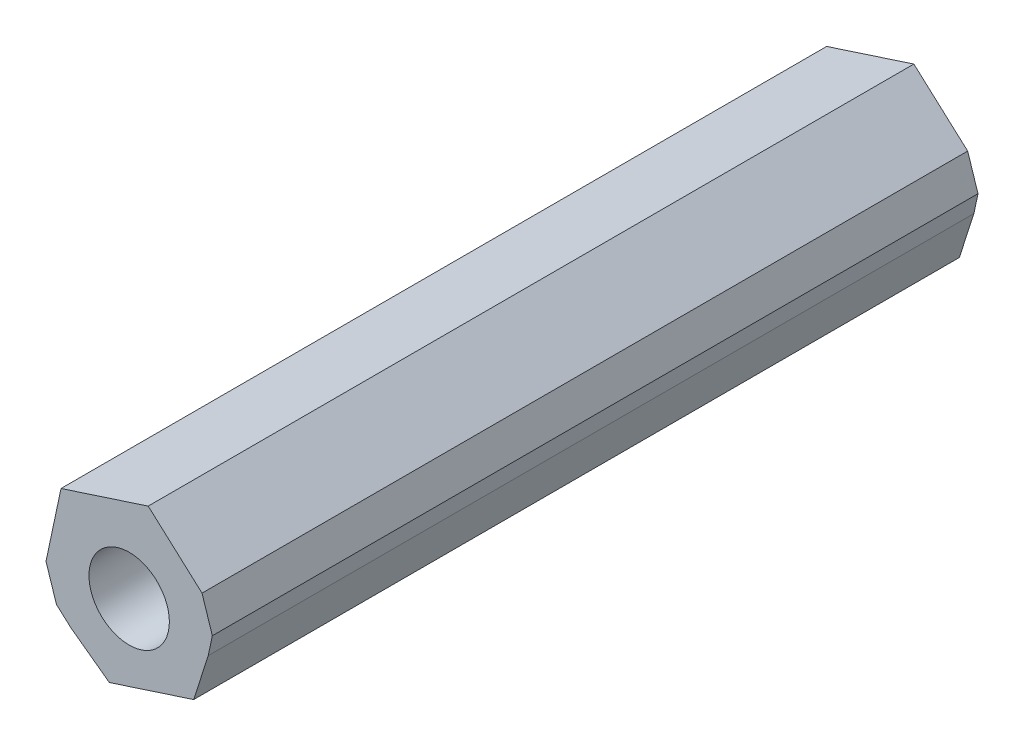
ISO-10303-21;
HEADER;
FILE_DESCRIPTION(('STEP AP214'),'2;1');
FILE_NAME('part.step','',(''),(''),'','','');
FILE_SCHEMA(('AUTOMOTIVE_DESIGN { 1 0 10303 214 1 1 1 1 }'));
ENDSEC;
DATA;
#1=APPLICATION_CONTEXT('core data for automotive mechanical design processes');
#2=APPLICATION_PROTOCOL_DEFINITION('international standard','automotive_design',2000,#1);
#3=PRODUCT_CONTEXT('',#1,'mechanical');
#4=PRODUCT('Part','Part','',(#3));
#5=PRODUCT_RELATED_PRODUCT_CATEGORY('part','',(#4));
#6=PRODUCT_DEFINITION_FORMATION('','',#4);
#7=PRODUCT_DEFINITION_CONTEXT('part definition',#1,'design');
#8=PRODUCT_DEFINITION('design','',#6,#7);
#9=PRODUCT_DEFINITION_SHAPE('','',#8);
#10=(LENGTH_UNIT() NAMED_UNIT(*) SI_UNIT(.MILLI.,.METRE.));
#11=(NAMED_UNIT(*) PLANE_ANGLE_UNIT() SI_UNIT($,.RADIAN.));
#12=(NAMED_UNIT(*) SI_UNIT($,.STERADIAN.) SOLID_ANGLE_UNIT());
#13=UNCERTAINTY_MEASURE_WITH_UNIT(LENGTH_MEASURE(1.E-05),#10,'distance_accuracy_value','');
#14=(GEOMETRIC_REPRESENTATION_CONTEXT(3) GLOBAL_UNCERTAINTY_ASSIGNED_CONTEXT((#13)) GLOBAL_UNIT_ASSIGNED_CONTEXT((#10,
#11,#12)) REPRESENTATION_CONTEXT('',''));
#15=CARTESIAN_POINT('',(0.,0.,0.));
#16=DIRECTION('',(0.,0.,1.));
#17=DIRECTION('',(1.,0.,0.));
#18=AXIS2_PLACEMENT_3D('',#15,#16,#17);
#19=CARTESIAN_POINT('',(0.,0.,23.8));
#20=DIRECTION('',(0.,0.,-1.));
#21=DIRECTION('',(-1.,0.,0.));
#22=AXIS2_PLACEMENT_3D('',#19,#20,#21);
#23=PLANE('',#22);
#24=DIRECTION('',(0.806848201508778,-0.590758816880502,0.));
#25=VECTOR('',#24,1.);
#26=CARTESIAN_POINT('',(-1.81056442175329,-1.6910093841118,23.8));
#27=LINE('',#26,#25);
#28=CARTESIAN_POINT('',(-1.81056442175329,-1.6910093841118,23.8));
#29=VERTEX_POINT('',#28);
#30=CARTESIAN_POINT('',(-0.615744095653542,-2.5658339681061,23.8));
#31=VERTEX_POINT('',#30);
#32=EDGE_CURVE('E182',#29,#31,#27,.T.);
#33=ORIENTED_EDGE('',*,*,#32,.T.);
#34=DIRECTION('',(0.951061509544699,0.309001626310541,0.));
#35=VECTOR('',#34,1.);
#36=CARTESIAN_POINT('',(-0.615744095653542,-2.5658339681061,23.8));
#37=LINE('',#36,#35);
#38=CARTESIAN_POINT('',(2.00625141405096,-1.71394282484504,23.8));
#39=VERTEX_POINT('',#38);
#40=EDGE_CURVE('E106',#31,#39,#37,.T.);
#41=ORIENTED_EDGE('',*,*,#40,.T.);
#42=DIRECTION('',(0.305545359113446,0.952177522064155,0.));
#43=VECTOR('',#42,1.);
#44=CARTESIAN_POINT('',(2.45871794360576,-0.303911724459414,23.8));
#45=LINE('',#44,#43);
#46=CARTESIAN_POINT('',(2.45871794360576,-0.303911724459414,23.8));
#47=VERTEX_POINT('',#46);
#48=EDGE_CURVE('E211',#39,#47,#45,.T.);
#49=ORIENTED_EDGE('',*,*,#48,.T.);
#50=DIRECTION('',(0.20792749657669,0.978144240982561,0.));
#51=VECTOR('',#50,1.);
#52=CARTESIAN_POINT('',(2.5859251555958,0.294503607173342,23.8));
#53=LINE('',#52,#51);
#54=CARTESIAN_POINT('',(2.5859251555958,0.294503607173342,23.8));
#55=VERTEX_POINT('',#54);
#56=EDGE_CURVE('E231',#47,#55,#53,.T.);
#57=ORIENTED_EDGE('',*,*,#56,.T.);
#58=DIRECTION('',(-0.309001626310541,0.951061509544699,0.));
#59=VECTOR('',#58,1.);
#60=CARTESIAN_POINT('',(2.26520369496625,1.28163704116757,23.8));
#61=LINE('',#60,#59);
#62=CARTESIAN_POINT('',(2.26520369496625,1.28163704116757,23.8));
#63=VERTEX_POINT('',#62);
#64=EDGE_CURVE('E227',#55,#63,#61,.T.);
#65=ORIENTED_EDGE('',*,*,#64,.T.);
#66=DIRECTION('',(-0.743134012967995,0.669142614672002,0.));
#67=VECTOR('',#66,1.);
#68=CARTESIAN_POINT('',(0.592593365243585,2.78771108680034,23.8));
#69=LINE('',#68,#67);
#70=CARTESIAN_POINT('',(0.592593365243585,2.78771108680034,23.8));
#71=VERTEX_POINT('',#70);
#72=EDGE_CURVE('E230',#63,#71,#69,.T.);
#73=ORIENTED_EDGE('',*,*,#72,.T.);
#74=DIRECTION('',(-0.951061509544693,-0.309001626310557,0.));
#75=VECTOR('',#74,1.);
#76=CARTESIAN_POINT('',(0.592593365243585,2.78771108680034,23.8));
#77=LINE('',#76,#75);
#78=CARTESIAN_POINT('',(-2.11793193695881,1.90705645181525,23.8));
#79=VERTEX_POINT('',#78);
#80=EDGE_CURVE('E131',#71,#79,#77,.T.);
#81=ORIENTED_EDGE('',*,*,#80,.T.);
#82=DIRECTION('',(-0.20792749657669,-0.978144240982561,0.));
#83=VECTOR('',#82,1.);
#84=CARTESIAN_POINT('',(-2.11793193695881,1.90705645181525,23.8));
#85=LINE('',#84,#83);
#86=CARTESIAN_POINT('',(-2.58462162290409,-0.288371455262786,23.8));
#87=VERTEX_POINT('',#86);
#88=EDGE_CURVE('E125',#79,#87,#85,.T.);
#89=ORIENTED_EDGE('',*,*,#88,.T.);
#90=DIRECTION('',(0.309001626310541,-0.951061509544699,0.));
#91=VECTOR('',#90,1.);
#92=CARTESIAN_POINT('',(-2.58462162290409,-0.288371455262786,23.8));
#93=LINE('',#92,#91);
#94=CARTESIAN_POINT('',(-2.26054486197784,-1.28583200954843,23.8));
#95=VERTEX_POINT('',#94);
#96=EDGE_CURVE('E129',#87,#95,#93,.T.);
#97=ORIENTED_EDGE('',*,*,#96,.T.);
#98=DIRECTION('',(0.743134012967984,-0.669142614672015,0.));
#99=VECTOR('',#98,1.);
#100=CARTESIAN_POINT('',(-2.26054486197784,-1.28583200954843,23.8));
#101=LINE('',#100,#99);
#102=EDGE_CURVE('E57',#95,#29,#101,.T.);
#103=ORIENTED_EDGE('',*,*,#102,.T.);
#104=EDGE_LOOP('',(#33,#41,#49,#57,#65,#73,#81,#89,#97,#103));
#105=FACE_BOUND('',#104,.T.);
#106=CARTESIAN_POINT('',(0.,0.,23.8));
#107=DIRECTION('',(0.,0.,1.));
#108=DIRECTION('',(1.,0.,0.));
#109=AXIS2_PLACEMENT_3D('',#106,#107,#108);
#110=CIRCLE('',#109,1.25);
#111=CARTESIAN_POINT('',(1.25,0.,23.8));
#112=VERTEX_POINT('',#111);
#113=EDGE_CURVE('E158',#112,#112,#110,.T.);
#114=ORIENTED_EDGE('',*,*,#113,.F.);
#115=EDGE_LOOP('',(#114));
#116=FACE_BOUND('',#115,.T.);
#117=ADVANCED_FACE('F39',(#105,#116),#23,.F.);
#118=CARTESIAN_POINT('',(0.,0.,0.));
#119=DIRECTION('',(0.,0.,-1.));
#120=DIRECTION('',(-1.,0.,0.));
#121=AXIS2_PLACEMENT_3D('',#118,#119,#120);
#122=PLANE('',#121);
#123=DIRECTION('',(0.806848201508778,-0.590758816880502,0.));
#124=VECTOR('',#123,1.);
#125=CARTESIAN_POINT('',(-1.81056442175329,-1.6910093841118,0.));
#126=LINE('',#125,#124);
#127=CARTESIAN_POINT('',(-1.81056442175329,-1.6910093841118,0.));
#128=VERTEX_POINT('',#127);
#129=CARTESIAN_POINT('',(-0.615744095653542,-2.5658339681061,0.));
#130=VERTEX_POINT('',#129);
#131=EDGE_CURVE('E153',#128,#130,#126,.T.);
#132=ORIENTED_EDGE('',*,*,#131,.F.);
#133=DIRECTION('',(0.743134012967984,-0.669142614672015,0.));
#134=VECTOR('',#133,1.);
#135=CARTESIAN_POINT('',(-2.26054486197784,-1.28583200954843,0.));
#136=LINE('',#135,#134);
#137=CARTESIAN_POINT('',(-2.26054486197784,-1.28583200954843,0.));
#138=VERTEX_POINT('',#137);
#139=EDGE_CURVE('E98',#138,#128,#136,.T.);
#140=ORIENTED_EDGE('',*,*,#139,.F.);
#141=DIRECTION('',(0.309001626310541,-0.951061509544699,0.));
#142=VECTOR('',#141,1.);
#143=CARTESIAN_POINT('',(-2.58462162290409,-0.288371455262786,0.));
#144=LINE('',#143,#142);
#145=CARTESIAN_POINT('',(-2.58462162290409,-0.288371455262786,0.));
#146=VERTEX_POINT('',#145);
#147=EDGE_CURVE('E92',#146,#138,#144,.T.);
#148=ORIENTED_EDGE('',*,*,#147,.F.);
#149=DIRECTION('',(-0.20792749657669,-0.978144240982561,0.));
#150=VECTOR('',#149,1.);
#151=CARTESIAN_POINT('',(-2.11793193695881,1.90705645181525,0.));
#152=LINE('',#151,#150);
#153=CARTESIAN_POINT('',(-2.11793193695881,1.90705645181525,0.));
#154=VERTEX_POINT('',#153);
#155=EDGE_CURVE('E140',#154,#146,#152,.T.);
#156=ORIENTED_EDGE('',*,*,#155,.F.);
#157=DIRECTION('',(-0.951061509544693,-0.309001626310557,0.));
#158=VECTOR('',#157,1.);
#159=CARTESIAN_POINT('',(0.592593365243585,2.78771108680034,0.));
#160=LINE('',#159,#158);
#161=CARTESIAN_POINT('',(0.592593365243585,2.78771108680034,0.));
#162=VERTEX_POINT('',#161);
#163=EDGE_CURVE('E173',#162,#154,#160,.T.);
#164=ORIENTED_EDGE('',*,*,#163,.F.);
#165=DIRECTION('',(-0.743134012967995,0.669142614672002,0.));
#166=VECTOR('',#165,1.);
#167=CARTESIAN_POINT('',(0.592593365243585,2.78771108680034,0.));
#168=LINE('',#167,#166);
#169=CARTESIAN_POINT('',(2.26520369496625,1.28163704116757,0.));
#170=VERTEX_POINT('',#169);
#171=EDGE_CURVE('E170',#170,#162,#168,.T.);
#172=ORIENTED_EDGE('',*,*,#171,.F.);
#173=DIRECTION('',(-0.309001626310541,0.951061509544699,0.));
#174=VECTOR('',#173,1.);
#175=CARTESIAN_POINT('',(2.26520369496625,1.28163704116757,0.));
#176=LINE('',#175,#174);
#177=CARTESIAN_POINT('',(2.5859251555958,0.294503607173342,0.));
#178=VERTEX_POINT('',#177);
#179=EDGE_CURVE('E167',#178,#170,#176,.T.);
#180=ORIENTED_EDGE('',*,*,#179,.F.);
#181=DIRECTION('',(0.20792749657669,0.978144240982561,0.));
#182=VECTOR('',#181,1.);
#183=CARTESIAN_POINT('',(2.5859251555958,0.294503607173342,0.));
#184=LINE('',#183,#182);
#185=CARTESIAN_POINT('',(2.45871794360576,-0.303911724459414,0.));
#186=VERTEX_POINT('',#185);
#187=EDGE_CURVE('E164',#186,#178,#184,.T.);
#188=ORIENTED_EDGE('',*,*,#187,.F.);
#189=DIRECTION('',(0.305545359113446,0.952177522064155,0.));
#190=VECTOR('',#189,1.);
#191=CARTESIAN_POINT('',(2.45871794360576,-0.303911724459414,0.));
#192=LINE('',#191,#190);
#193=CARTESIAN_POINT('',(2.00625141405096,-1.71394282484504,0.));
#194=VERTEX_POINT('',#193);
#195=EDGE_CURVE('E161',#194,#186,#192,.T.);
#196=ORIENTED_EDGE('',*,*,#195,.F.);
#197=DIRECTION('',(0.951061509544699,0.309001626310541,0.));
#198=VECTOR('',#197,1.);
#199=CARTESIAN_POINT('',(-0.615744095653542,-2.5658339681061,0.));
#200=LINE('',#199,#198);
#201=EDGE_CURVE('E157',#130,#194,#200,.T.);
#202=ORIENTED_EDGE('',*,*,#201,.F.);
#203=EDGE_LOOP('',(#132,#140,#148,#156,#164,#172,#180,#188,#196,#202));
#204=FACE_BOUND('',#203,.T.);
#205=CARTESIAN_POINT('',(0.,0.,0.));
#206=DIRECTION('',(0.,0.,1.));
#207=DIRECTION('',(1.,0.,0.));
#208=AXIS2_PLACEMENT_3D('',#205,#206,#207);
#209=CIRCLE('',#208,1.25);
#210=CARTESIAN_POINT('',(1.25,0.,0.));
#211=VERTEX_POINT('',#210);
#212=EDGE_CURVE('E245',#211,#211,#209,.T.);
#213=ORIENTED_EDGE('',*,*,#212,.T.);
#214=EDGE_LOOP('',(#213));
#215=FACE_BOUND('',#214,.T.);
#216=ADVANCED_FACE('F215',(#204,#215),#122,.T.);
#217=CARTESIAN_POINT('',(-1.81056442175329,-1.6910093841118,23.8));
#218=DIRECTION('',(0.590758816880502,0.806848201508778,0.));
#219=DIRECTION('',(-0.806848201508778,0.590758816880502,0.));
#220=AXIS2_PLACEMENT_3D('',#217,#218,#219);
#221=PLANE('',#220);
#222=ORIENTED_EDGE('',*,*,#131,.T.);
#223=DIRECTION('',(0.,0.,-1.));
#224=VECTOR('',#223,1.);
#225=CARTESIAN_POINT('',(-0.615744095653542,-2.5658339681061,23.8));
#226=LINE('',#225,#224);
#227=EDGE_CURVE('E11',#31,#130,#226,.T.);
#228=ORIENTED_EDGE('',*,*,#227,.F.);
#229=ORIENTED_EDGE('',*,*,#32,.F.);
#230=DIRECTION('',(0.,0.,-1.));
#231=VECTOR('',#230,1.);
#232=CARTESIAN_POINT('',(-1.81056442175329,-1.6910093841118,23.8));
#233=LINE('',#232,#231);
#234=EDGE_CURVE('E149',#29,#128,#233,.T.);
#235=ORIENTED_EDGE('',*,*,#234,.T.);
#236=EDGE_LOOP('',(#222,#228,#229,#235));
#237=FACE_BOUND('',#236,.T.);
#238=ADVANCED_FACE('F41',(#237),#221,.F.);
#239=CARTESIAN_POINT('',(-0.615744095653542,-2.5658339681061,23.8));
#240=DIRECTION('',(-0.309001626310541,0.951061509544699,0.));
#241=DIRECTION('',(-0.951061509544699,-0.309001626310541,0.));
#242=AXIS2_PLACEMENT_3D('',#239,#240,#241);
#243=PLANE('',#242);
#244=ORIENTED_EDGE('',*,*,#201,.T.);
#245=DIRECTION('',(0.,0.,-1.));
#246=VECTOR('',#245,1.);
#247=CARTESIAN_POINT('',(2.00625141405096,-1.71394282484504,23.8));
#248=LINE('',#247,#246);
#249=EDGE_CURVE('E49',#39,#194,#248,.T.);
#250=ORIENTED_EDGE('',*,*,#249,.F.);
#251=ORIENTED_EDGE('',*,*,#40,.F.);
#252=ORIENTED_EDGE('',*,*,#227,.T.);
#253=EDGE_LOOP('',(#244,#250,#251,#252));
#254=FACE_BOUND('',#253,.T.);
#255=ADVANCED_FACE('F283',(#254),#243,.F.);
#256=CARTESIAN_POINT('',(2.45871794360576,-0.303911724459414,23.8));
#257=DIRECTION('',(-0.952177522064155,0.305545359113446,0.));
#258=DIRECTION('',(-0.305545359113446,-0.952177522064156,0.));
#259=AXIS2_PLACEMENT_3D('',#256,#257,#258);
#260=PLANE('',#259);
#261=ORIENTED_EDGE('',*,*,#195,.T.);
#262=DIRECTION('',(0.,0.,-1.));
#263=VECTOR('',#262,1.);
#264=CARTESIAN_POINT('',(2.45871794360576,-0.303911724459414,23.8));
#265=LINE('',#264,#263);
#266=EDGE_CURVE('E201',#47,#186,#265,.T.);
#267=ORIENTED_EDGE('',*,*,#266,.F.);
#268=ORIENTED_EDGE('',*,*,#48,.F.);
#269=ORIENTED_EDGE('',*,*,#249,.T.);
#270=EDGE_LOOP('',(#261,#267,#268,#269));
#271=FACE_BOUND('',#270,.T.);
#272=ADVANCED_FACE('F209',(#271),#260,.F.);
#273=CARTESIAN_POINT('',(2.5859251555958,0.294503607173342,23.8));
#274=DIRECTION('',(-0.978144240982561,0.20792749657669,0.));
#275=DIRECTION('',(-0.20792749657669,-0.978144240982561,0.));
#276=AXIS2_PLACEMENT_3D('',#273,#274,#275);
#277=PLANE('',#276);
#278=ORIENTED_EDGE('',*,*,#187,.T.);
#279=DIRECTION('',(0.,0.,-1.));
#280=VECTOR('',#279,1.);
#281=CARTESIAN_POINT('',(2.5859251555958,0.294503607173342,23.8));
#282=LINE('',#281,#280);
#283=EDGE_CURVE('E197',#55,#178,#282,.T.);
#284=ORIENTED_EDGE('',*,*,#283,.F.);
#285=ORIENTED_EDGE('',*,*,#56,.F.);
#286=ORIENTED_EDGE('',*,*,#266,.T.);
#287=EDGE_LOOP('',(#278,#284,#285,#286));
#288=FACE_BOUND('',#287,.T.);
#289=ADVANCED_FACE('F221',(#288),#277,.F.);
#290=CARTESIAN_POINT('',(2.26520369496625,1.28163704116757,23.8));
#291=DIRECTION('',(-0.951061509544699,-0.309001626310541,0.));
#292=DIRECTION('',(0.309001626310541,-0.951061509544699,0.));
#293=AXIS2_PLACEMENT_3D('',#290,#291,#292);
#294=PLANE('',#293);
#295=ORIENTED_EDGE('',*,*,#179,.T.);
#296=DIRECTION('',(0.,0.,-1.));
#297=VECTOR('',#296,1.);
#298=CARTESIAN_POINT('',(2.26520369496625,1.28163704116757,23.8));
#299=LINE('',#298,#297);
#300=EDGE_CURVE('E193',#63,#170,#299,.T.);
#301=ORIENTED_EDGE('',*,*,#300,.F.);
#302=ORIENTED_EDGE('',*,*,#64,.F.);
#303=ORIENTED_EDGE('',*,*,#283,.T.);
#304=EDGE_LOOP('',(#295,#301,#302,#303));
#305=FACE_BOUND('',#304,.T.);
#306=ADVANCED_FACE('F225',(#305),#294,.F.);
#307=CARTESIAN_POINT('',(0.592593365243585,2.78771108680034,23.8));
#308=DIRECTION('',(-0.669142614672002,-0.743134012967995,0.));
#309=DIRECTION('',(0.743134012967995,-0.669142614672002,0.));
#310=AXIS2_PLACEMENT_3D('',#307,#308,#309);
#311=PLANE('',#310);
#312=ORIENTED_EDGE('',*,*,#171,.T.);
#313=DIRECTION('',(0.,0.,-1.));
#314=VECTOR('',#313,1.);
#315=CARTESIAN_POINT('',(0.592593365243585,2.78771108680034,23.8));
#316=LINE('',#315,#314);
#317=EDGE_CURVE('E189',#71,#162,#316,.T.);
#318=ORIENTED_EDGE('',*,*,#317,.F.);
#319=ORIENTED_EDGE('',*,*,#72,.F.);
#320=ORIENTED_EDGE('',*,*,#300,.T.);
#321=EDGE_LOOP('',(#312,#318,#319,#320));
#322=FACE_BOUND('',#321,.T.);
#323=ADVANCED_FACE('F273',(#322),#311,.F.);
#324=CARTESIAN_POINT('',(0.592593365243585,2.78771108680034,23.8));
#325=DIRECTION('',(0.309001626310557,-0.951061509544693,0.));
#326=DIRECTION('',(0.951061509544693,0.309001626310557,0.));
#327=AXIS2_PLACEMENT_3D('',#324,#325,#326);
#328=PLANE('',#327);
#329=ORIENTED_EDGE('',*,*,#163,.T.);
#330=DIRECTION('',(0.,0.,-1.));
#331=VECTOR('',#330,1.);
#332=CARTESIAN_POINT('',(-2.11793193695881,1.90705645181525,23.8));
#333=LINE('',#332,#331);
#334=EDGE_CURVE('E142',#79,#154,#333,.T.);
#335=ORIENTED_EDGE('',*,*,#334,.F.);
#336=ORIENTED_EDGE('',*,*,#80,.F.);
#337=ORIENTED_EDGE('',*,*,#317,.T.);
#338=EDGE_LOOP('',(#329,#335,#336,#337));
#339=FACE_BOUND('',#338,.T.);
#340=ADVANCED_FACE('F270',(#339),#328,.F.);
#341=CARTESIAN_POINT('',(-2.11793193695881,1.90705645181525,23.8));
#342=DIRECTION('',(0.978144240982561,-0.20792749657669,0.));
#343=DIRECTION('',(0.20792749657669,0.978144240982561,0.));
#344=AXIS2_PLACEMENT_3D('',#341,#342,#343);
#345=PLANE('',#344);
#346=ORIENTED_EDGE('',*,*,#155,.T.);
#347=DIRECTION('',(0.,0.,-1.));
#348=VECTOR('',#347,1.);
#349=CARTESIAN_POINT('',(-2.58462162290409,-0.288371455262786,23.8));
#350=LINE('',#349,#348);
#351=EDGE_CURVE('E137',#87,#146,#350,.T.);
#352=ORIENTED_EDGE('',*,*,#351,.F.);
#353=ORIENTED_EDGE('',*,*,#88,.F.);
#354=ORIENTED_EDGE('',*,*,#334,.T.);
#355=EDGE_LOOP('',(#346,#352,#353,#354));
#356=FACE_BOUND('',#355,.T.);
#357=ADVANCED_FACE('F138',(#356),#345,.F.);
#358=CARTESIAN_POINT('',(-2.58462162290409,-0.288371455262786,23.8));
#359=DIRECTION('',(0.951061509544699,0.309001626310541,0.));
#360=DIRECTION('',(-0.309001626310541,0.951061509544699,0.));
#361=AXIS2_PLACEMENT_3D('',#358,#359,#360);
#362=PLANE('',#361);
#363=ORIENTED_EDGE('',*,*,#147,.T.);
#364=DIRECTION('',(0.,0.,-1.));
#365=VECTOR('',#364,1.);
#366=CARTESIAN_POINT('',(-2.26054486197784,-1.28583200954843,23.8));
#367=LINE('',#366,#365);
#368=EDGE_CURVE('E143',#95,#138,#367,.T.);
#369=ORIENTED_EDGE('',*,*,#368,.F.);
#370=ORIENTED_EDGE('',*,*,#96,.F.);
#371=ORIENTED_EDGE('',*,*,#351,.T.);
#372=EDGE_LOOP('',(#363,#369,#370,#371));
#373=FACE_BOUND('',#372,.T.);
#374=ADVANCED_FACE('F145',(#373),#362,.F.);
#375=CARTESIAN_POINT('',(-2.26054486197784,-1.28583200954843,23.8));
#376=DIRECTION('',(0.669142614672015,0.743134012967984,0.));
#377=DIRECTION('',(-0.743134012967984,0.669142614672015,0.));
#378=AXIS2_PLACEMENT_3D('',#375,#376,#377);
#379=PLANE('',#378);
#380=ORIENTED_EDGE('',*,*,#139,.T.);
#381=ORIENTED_EDGE('',*,*,#234,.F.);
#382=ORIENTED_EDGE('',*,*,#102,.F.);
#383=ORIENTED_EDGE('',*,*,#368,.T.);
#384=EDGE_LOOP('',(#380,#381,#382,#383));
#385=FACE_BOUND('',#384,.T.);
#386=ADVANCED_FACE('F263',(#385),#379,.F.);
#387=CARTESIAN_POINT('',(0.,0.,23.8));
#388=DIRECTION('',(0.,0.,-1.));
#389=DIRECTION('',(-1.,0.,0.));
#390=AXIS2_PLACEMENT_3D('',#387,#388,#389);
#391=CYLINDRICAL_SURFACE('',#390,1.25);
#392=ORIENTED_EDGE('',*,*,#113,.T.);
#393=EDGE_LOOP('',(#392));
#394=FACE_BOUND('',#393,.T.);
#395=ORIENTED_EDGE('',*,*,#212,.F.);
#396=EDGE_LOOP('',(#395));
#397=FACE_BOUND('',#396,.T.);
#398=ADVANCED_FACE('F253',(#394,#397),#391,.F.);
#399=CLOSED_SHELL('',(#117,#216,#238,#255,#272,#289,#306,#323,#340,#357,#374,#386,#398));
#400=MANIFOLD_SOLID_BREP('B2',#399);
#401=ADVANCED_BREP_SHAPE_REPRESENTATION('',(#18,#400),#14);
#402=SHAPE_DEFINITION_REPRESENTATION(#9,#401);
ENDSEC;
END-ISO-10303-21;
